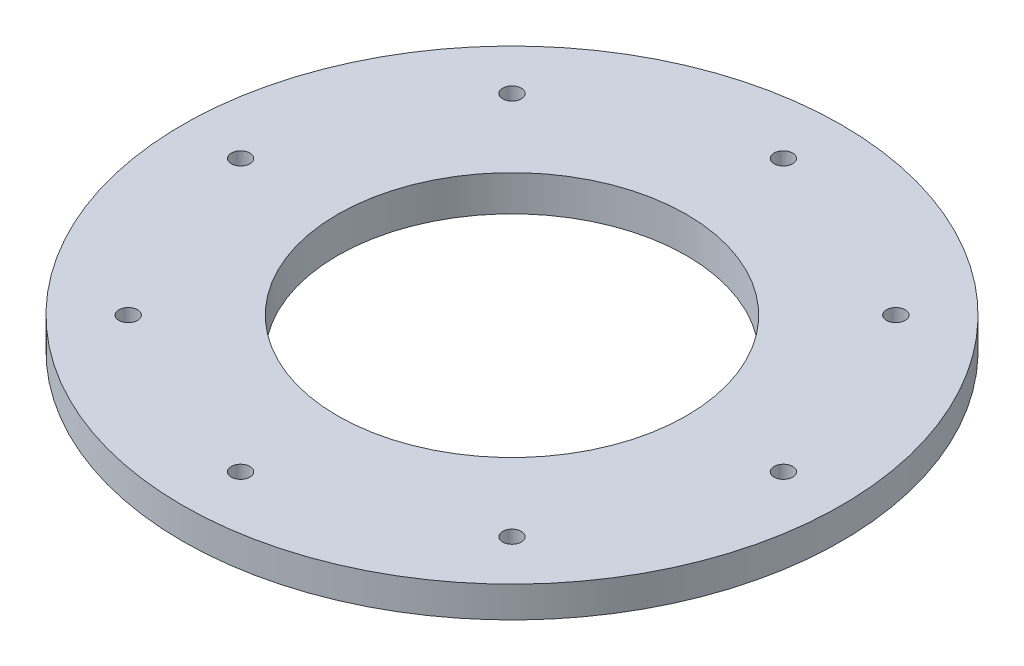
ISO-10303-21;
HEADER;
FILE_DESCRIPTION(('STEP AP214'),'2;1');
FILE_NAME('part.step','',(''),(''),'','','');
FILE_SCHEMA(('AUTOMOTIVE_DESIGN { 1 0 10303 214 1 1 1 1 }'));
ENDSEC;
DATA;
#1=APPLICATION_CONTEXT('core data for automotive mechanical design processes');
#2=APPLICATION_PROTOCOL_DEFINITION('international standard','automotive_design',2000,#1);
#3=PRODUCT_CONTEXT('',#1,'mechanical');
#4=PRODUCT('Part','Part','',(#3));
#5=PRODUCT_RELATED_PRODUCT_CATEGORY('part','',(#4));
#6=PRODUCT_DEFINITION_FORMATION('','',#4);
#7=PRODUCT_DEFINITION_CONTEXT('part definition',#1,'design');
#8=PRODUCT_DEFINITION('design','',#6,#7);
#9=PRODUCT_DEFINITION_SHAPE('','',#8);
#10=(LENGTH_UNIT() NAMED_UNIT(*) SI_UNIT(.MILLI.,.METRE.));
#11=(NAMED_UNIT(*) PLANE_ANGLE_UNIT() SI_UNIT($,.RADIAN.));
#12=(NAMED_UNIT(*) SI_UNIT($,.STERADIAN.) SOLID_ANGLE_UNIT());
#13=UNCERTAINTY_MEASURE_WITH_UNIT(LENGTH_MEASURE(1.E-05),#10,'distance_accuracy_value','');
#14=(GEOMETRIC_REPRESENTATION_CONTEXT(3) GLOBAL_UNCERTAINTY_ASSIGNED_CONTEXT((#13)) GLOBAL_UNIT_ASSIGNED_CONTEXT((#10,
#11,#12)) REPRESENTATION_CONTEXT('',''));
#15=CARTESIAN_POINT('',(0.,0.,0.));
#16=DIRECTION('',(0.,0.,1.));
#17=DIRECTION('',(1.,0.,0.));
#18=AXIS2_PLACEMENT_3D('',#15,#16,#17);
#19=CARTESIAN_POINT('',(0.,0.6,0.));
#20=DIRECTION('',(0.,-1.,0.));
#21=DIRECTION('',(0.,0.,-1.));
#22=AXIS2_PLACEMENT_3D('',#19,#20,#21);
#23=CYLINDRICAL_SURFACE('',#22,40.);
#24=CARTESIAN_POINT('',(0.,0.6,0.));
#25=DIRECTION('',(0.,1.,0.));
#26=DIRECTION('',(0.,0.,1.));
#27=AXIS2_PLACEMENT_3D('',#24,#25,#26);
#28=CIRCLE('',#27,40.);
#29=CARTESIAN_POINT('',(0.,0.6,40.));
#30=VERTEX_POINT('',#29);
#31=EDGE_CURVE('E10',#30,#30,#28,.T.);
#32=ORIENTED_EDGE('',*,*,#31,.F.);
#33=EDGE_LOOP('',(#32));
#34=FACE_BOUND('',#33,.T.);
#35=CARTESIAN_POINT('',(0.,0.,0.));
#36=DIRECTION('',(0.,1.,0.));
#37=DIRECTION('',(0.,0.,1.));
#38=AXIS2_PLACEMENT_3D('',#35,#36,#37);
#39=CIRCLE('',#38,40.);
#40=CARTESIAN_POINT('',(0.,0.,40.));
#41=VERTEX_POINT('',#40);
#42=EDGE_CURVE('E44',#41,#41,#39,.T.);
#43=ORIENTED_EDGE('',*,*,#42,.T.);
#44=EDGE_LOOP('',(#43));
#45=FACE_BOUND('',#44,.T.);
#46=ADVANCED_FACE('F41',(#34,#45),#23,.T.);
#47=CARTESIAN_POINT('',(0.,0.,0.));
#48=DIRECTION('',(0.,1.,0.));
#49=DIRECTION('',(0.,0.,1.));
#50=AXIS2_PLACEMENT_3D('',#47,#48,#49);
#51=PLANE('',#50);
#52=CARTESIAN_POINT('',(0.,0.,35.));
#53=DIRECTION('',(0.,-1.,0.));
#54=DIRECTION('',(0.,0.,-1.));
#55=AXIS2_PLACEMENT_3D('',#52,#53,#54);
#56=CIRCLE('',#55,1.2);
#57=CARTESIAN_POINT('',(0.,0.,33.8));
#58=VERTEX_POINT('',#57);
#59=EDGE_CURVE('E127',#58,#58,#56,.T.);
#60=ORIENTED_EDGE('',*,*,#59,.F.);
#61=EDGE_LOOP('',(#60));
#62=FACE_BOUND('',#61,.T.);
#63=CARTESIAN_POINT('',(24.7487373415296,0.,24.7487373415287));
#64=DIRECTION('',(0.,-1.,0.));
#65=DIRECTION('',(0.,0.,-1.));
#66=AXIS2_PLACEMENT_3D('',#63,#64,#65);
#67=CIRCLE('',#66,1.2);
#68=CARTESIAN_POINT('',(24.7487373415296,0.,23.5487373415287));
#69=VERTEX_POINT('',#68);
#70=EDGE_CURVE('E123',#69,#69,#67,.T.);
#71=ORIENTED_EDGE('',*,*,#70,.F.);
#72=EDGE_LOOP('',(#71));
#73=FACE_BOUND('',#72,.T.);
#74=CARTESIAN_POINT('',(35.0000000000005,0.,-1.1408314719531E-12));
#75=DIRECTION('',(0.,-1.,0.));
#76=DIRECTION('',(0.,0.,-1.));
#77=AXIS2_PLACEMENT_3D('',#74,#75,#76);
#78=CIRCLE('',#77,1.2);
#79=CARTESIAN_POINT('',(35.0000000000005,0.,-1.20000000000114));
#80=VERTEX_POINT('',#79);
#81=EDGE_CURVE('E115',#80,#80,#78,.T.);
#82=ORIENTED_EDGE('',*,*,#81,.F.);
#83=EDGE_LOOP('',(#82));
#84=FACE_BOUND('',#83,.T.);
#85=CARTESIAN_POINT('',(24.7487373415292,0.,-24.7487373415308));
#86=DIRECTION('',(0.,-1.,0.));
#87=DIRECTION('',(0.,0.,-1.));
#88=AXIS2_PLACEMENT_3D('',#85,#86,#87);
#89=CIRCLE('',#88,1.2);
#90=CARTESIAN_POINT('',(24.7487373415292,0.,-25.9487373415308));
#91=VERTEX_POINT('',#90);
#92=EDGE_CURVE('E107',#91,#91,#89,.T.);
#93=ORIENTED_EDGE('',*,*,#92,.F.);
#94=EDGE_LOOP('',(#93));
#95=FACE_BOUND('',#94,.T.);
#96=CARTESIAN_POINT('',(-6.7183955819972E-13,0.,-35.0000000000016));
#97=DIRECTION('',(0.,-1.,0.));
#98=DIRECTION('',(0.,0.,-1.));
#99=AXIS2_PLACEMENT_3D('',#96,#97,#98);
#100=CIRCLE('',#99,1.2);
#101=CARTESIAN_POINT('',(-6.7183955819972E-13,0.,-36.2000000000016));
#102=VERTEX_POINT('',#101);
#103=EDGE_CURVE('E99',#102,#102,#100,.T.);
#104=ORIENTED_EDGE('',*,*,#103,.F.);
#105=EDGE_LOOP('',(#104));
#106=FACE_BOUND('',#105,.T.);
#107=CARTESIAN_POINT('',(-24.7487373415303,0.,-24.7487373415303));
#108=DIRECTION('',(0.,-1.,0.));
#109=DIRECTION('',(0.,0.,-1.));
#110=AXIS2_PLACEMENT_3D('',#107,#108,#109);
#111=CIRCLE('',#110,1.2);
#112=CARTESIAN_POINT('',(-24.7487373415303,0.,-25.9487373415303));
#113=VERTEX_POINT('',#112);
#114=EDGE_CURVE('E92',#113,#113,#111,.T.);
#115=ORIENTED_EDGE('',*,*,#114,.F.);
#116=EDGE_LOOP('',(#115));
#117=FACE_BOUND('',#116,.T.);
#118=CARTESIAN_POINT('',(-35.0000000000012,0.,-4.73278177550394E-13));
#119=DIRECTION('',(0.,-1.,0.));
#120=DIRECTION('',(0.,0.,-1.));
#121=AXIS2_PLACEMENT_3D('',#118,#119,#120);
#122=CIRCLE('',#121,1.2);
#123=CARTESIAN_POINT('',(-35.0000000000012,0.,-1.20000000000047));
#124=VERTEX_POINT('',#123);
#125=EDGE_CURVE('E84',#124,#124,#122,.T.);
#126=ORIENTED_EDGE('',*,*,#125,.F.);
#127=EDGE_LOOP('',(#126));
#128=FACE_BOUND('',#127,.T.);
#129=CARTESIAN_POINT('',(-24.7487373415298,0.,24.7487373415292));
#130=DIRECTION('',(0.,-1.,0.));
#131=DIRECTION('',(0.,0.,-1.));
#132=AXIS2_PLACEMENT_3D('',#129,#130,#131);
#133=CIRCLE('',#132,1.2);
#134=CARTESIAN_POINT('',(-24.7487373415298,0.,23.5487373415292));
#135=VERTEX_POINT('',#134);
#136=EDGE_CURVE('E76',#135,#135,#133,.T.);
#137=ORIENTED_EDGE('',*,*,#136,.F.);
#138=EDGE_LOOP('',(#137));
#139=FACE_BOUND('',#138,.T.);
#140=CARTESIAN_POINT('',(0.,0.,0.));
#141=DIRECTION('',(0.,-1.,0.));
#142=DIRECTION('',(0.,0.,-1.));
#143=AXIS2_PLACEMENT_3D('',#140,#141,#142);
#144=CIRCLE('',#143,22.5);
#145=CARTESIAN_POINT('',(0.,0.,-22.5));
#146=VERTEX_POINT('',#145);
#147=EDGE_CURVE('E64',#146,#146,#144,.T.);
#148=ORIENTED_EDGE('',*,*,#147,.F.);
#149=EDGE_LOOP('',(#148));
#150=FACE_BOUND('',#149,.T.);
#151=ORIENTED_EDGE('',*,*,#42,.F.);
#152=EDGE_LOOP('',(#151));
#153=FACE_BOUND('',#152,.T.);
#154=ADVANCED_FACE('F145',(#62,#73,#84,#95,#106,#117,#128,#139,#150,#153),#51,.F.);
#155=CARTESIAN_POINT('',(0.,4.6,0.));
#156=DIRECTION('',(0.,-1.,0.));
#157=DIRECTION('',(0.,0.,-1.));
#158=AXIS2_PLACEMENT_3D('',#155,#156,#157);
#159=CYLINDRICAL_SURFACE('',#158,42.5);
#160=CARTESIAN_POINT('',(0.,4.6,0.));
#161=DIRECTION('',(0.,1.,0.));
#162=DIRECTION('',(0.,0.,1.));
#163=AXIS2_PLACEMENT_3D('',#160,#161,#162);
#164=CIRCLE('',#163,42.5);
#165=CARTESIAN_POINT('',(0.,4.6,42.5));
#166=VERTEX_POINT('',#165);
#167=EDGE_CURVE('E54',#166,#166,#164,.T.);
#168=ORIENTED_EDGE('',*,*,#167,.F.);
#169=EDGE_LOOP('',(#168));
#170=FACE_BOUND('',#169,.T.);
#171=CARTESIAN_POINT('',(0.,0.6,0.));
#172=DIRECTION('',(0.,1.,0.));
#173=DIRECTION('',(0.,0.,1.));
#174=AXIS2_PLACEMENT_3D('',#171,#172,#173);
#175=CIRCLE('',#174,42.5);
#176=CARTESIAN_POINT('',(0.,0.6,42.5));
#177=VERTEX_POINT('',#176);
#178=EDGE_CURVE('E56',#177,#177,#175,.T.);
#179=ORIENTED_EDGE('',*,*,#178,.T.);
#180=EDGE_LOOP('',(#179));
#181=FACE_BOUND('',#180,.T.);
#182=ADVANCED_FACE('F148',(#170,#181),#159,.T.);
#183=CARTESIAN_POINT('',(0.,4.6,0.));
#184=DIRECTION('',(0.,1.,0.));
#185=DIRECTION('',(0.,0.,1.));
#186=AXIS2_PLACEMENT_3D('',#183,#184,#185);
#187=PLANE('',#186);
#188=CARTESIAN_POINT('',(0.,4.6,35.));
#189=DIRECTION('',(0.,-1.,0.));
#190=DIRECTION('',(0.,0.,-1.));
#191=AXIS2_PLACEMENT_3D('',#188,#189,#190);
#192=CIRCLE('',#191,1.2);
#193=CARTESIAN_POINT('',(0.,4.6,33.8));
#194=VERTEX_POINT('',#193);
#195=EDGE_CURVE('E68',#194,#194,#192,.T.);
#196=ORIENTED_EDGE('',*,*,#195,.T.);
#197=EDGE_LOOP('',(#196));
#198=FACE_BOUND('',#197,.T.);
#199=CARTESIAN_POINT('',(24.7487373415296,4.6,24.7487373415287));
#200=DIRECTION('',(0.,-1.,0.));
#201=DIRECTION('',(0.,0.,-1.));
#202=AXIS2_PLACEMENT_3D('',#199,#200,#201);
#203=CIRCLE('',#202,1.2);
#204=CARTESIAN_POINT('',(24.7487373415296,4.6,23.5487373415287));
#205=VERTEX_POINT('',#204);
#206=EDGE_CURVE('E119',#205,#205,#203,.T.);
#207=ORIENTED_EDGE('',*,*,#206,.T.);
#208=EDGE_LOOP('',(#207));
#209=FACE_BOUND('',#208,.T.);
#210=CARTESIAN_POINT('',(35.0000000000005,4.6,-1.1408314719531E-12));
#211=DIRECTION('',(0.,-1.,0.));
#212=DIRECTION('',(0.,0.,-1.));
#213=AXIS2_PLACEMENT_3D('',#210,#211,#212);
#214=CIRCLE('',#213,1.2);
#215=CARTESIAN_POINT('',(35.0000000000005,4.6,-1.20000000000114));
#216=VERTEX_POINT('',#215);
#217=EDGE_CURVE('E111',#216,#216,#214,.T.);
#218=ORIENTED_EDGE('',*,*,#217,.T.);
#219=EDGE_LOOP('',(#218));
#220=FACE_BOUND('',#219,.T.);
#221=CARTESIAN_POINT('',(24.7487373415292,4.6,-24.7487373415308));
#222=DIRECTION('',(0.,-1.,0.));
#223=DIRECTION('',(0.,0.,-1.));
#224=AXIS2_PLACEMENT_3D('',#221,#222,#223);
#225=CIRCLE('',#224,1.2);
#226=CARTESIAN_POINT('',(24.7487373415292,4.6,-25.9487373415308));
#227=VERTEX_POINT('',#226);
#228=EDGE_CURVE('E103',#227,#227,#225,.T.);
#229=ORIENTED_EDGE('',*,*,#228,.T.);
#230=EDGE_LOOP('',(#229));
#231=FACE_BOUND('',#230,.T.);
#232=CARTESIAN_POINT('',(-6.7183955819972E-13,4.6,-35.0000000000016));
#233=DIRECTION('',(0.,-1.,0.));
#234=DIRECTION('',(0.,0.,-1.));
#235=AXIS2_PLACEMENT_3D('',#232,#233,#234);
#236=CIRCLE('',#235,1.2);
#237=CARTESIAN_POINT('',(-6.7183955819972E-13,4.6,-36.2000000000016));
#238=VERTEX_POINT('',#237);
#239=EDGE_CURVE('E95',#238,#238,#236,.T.);
#240=ORIENTED_EDGE('',*,*,#239,.T.);
#241=EDGE_LOOP('',(#240));
#242=FACE_BOUND('',#241,.T.);
#243=CARTESIAN_POINT('',(-24.7487373415303,4.6,-24.7487373415303));
#244=DIRECTION('',(0.,-1.,0.));
#245=DIRECTION('',(0.,0.,-1.));
#246=AXIS2_PLACEMENT_3D('',#243,#244,#245);
#247=CIRCLE('',#246,1.2);
#248=CARTESIAN_POINT('',(-24.7487373415303,4.6,-25.9487373415303));
#249=VERTEX_POINT('',#248);
#250=EDGE_CURVE('E88',#249,#249,#247,.T.);
#251=ORIENTED_EDGE('',*,*,#250,.T.);
#252=EDGE_LOOP('',(#251));
#253=FACE_BOUND('',#252,.T.);
#254=CARTESIAN_POINT('',(-35.0000000000012,4.6,-4.73278177550394E-13));
#255=DIRECTION('',(0.,-1.,0.));
#256=DIRECTION('',(0.,0.,-1.));
#257=AXIS2_PLACEMENT_3D('',#254,#255,#256);
#258=CIRCLE('',#257,1.2);
#259=CARTESIAN_POINT('',(-35.0000000000012,4.6,-1.20000000000047));
#260=VERTEX_POINT('',#259);
#261=EDGE_CURVE('E80',#260,#260,#258,.T.);
#262=ORIENTED_EDGE('',*,*,#261,.T.);
#263=EDGE_LOOP('',(#262));
#264=FACE_BOUND('',#263,.T.);
#265=CARTESIAN_POINT('',(-24.7487373415298,4.6,24.7487373415292));
#266=DIRECTION('',(0.,-1.,0.));
#267=DIRECTION('',(0.,0.,-1.));
#268=AXIS2_PLACEMENT_3D('',#265,#266,#267);
#269=CIRCLE('',#268,1.2);
#270=CARTESIAN_POINT('',(-24.7487373415298,4.6,23.5487373415292));
#271=VERTEX_POINT('',#270);
#272=EDGE_CURVE('E72',#271,#271,#269,.T.);
#273=ORIENTED_EDGE('',*,*,#272,.T.);
#274=EDGE_LOOP('',(#273));
#275=FACE_BOUND('',#274,.T.);
#276=CARTESIAN_POINT('',(0.,4.6,0.));
#277=DIRECTION('',(0.,-1.,0.));
#278=DIRECTION('',(0.,0.,-1.));
#279=AXIS2_PLACEMENT_3D('',#276,#277,#278);
#280=CIRCLE('',#279,22.5);
#281=CARTESIAN_POINT('',(0.,4.6,-22.5));
#282=VERTEX_POINT('',#281);
#283=EDGE_CURVE('E60',#282,#282,#280,.T.);
#284=ORIENTED_EDGE('',*,*,#283,.T.);
#285=EDGE_LOOP('',(#284));
#286=FACE_BOUND('',#285,.T.);
#287=ORIENTED_EDGE('',*,*,#167,.T.);
#288=EDGE_LOOP('',(#287));
#289=FACE_BOUND('',#288,.T.);
#290=ADVANCED_FACE('F135',(#198,#209,#220,#231,#242,#253,#264,#275,#286,#289),#187,.T.);
#291=CARTESIAN_POINT('',(0.,0.6,0.));
#292=DIRECTION('',(0.,1.,0.));
#293=DIRECTION('',(0.,0.,1.));
#294=AXIS2_PLACEMENT_3D('',#291,#292,#293);
#295=PLANE('',#294);
#296=ORIENTED_EDGE('',*,*,#31,.T.);
#297=EDGE_LOOP('',(#296));
#298=FACE_BOUND('',#297,.T.);
#299=ORIENTED_EDGE('',*,*,#178,.F.);
#300=EDGE_LOOP('',(#299));
#301=FACE_BOUND('',#300,.T.);
#302=ADVANCED_FACE('F186',(#298,#301),#295,.F.);
#303=CARTESIAN_POINT('',(0.,4.6,0.));
#304=DIRECTION('',(0.,-1.,0.));
#305=DIRECTION('',(0.,0.,-1.));
#306=AXIS2_PLACEMENT_3D('',#303,#304,#305);
#307=CYLINDRICAL_SURFACE('',#306,22.5);
#308=ORIENTED_EDGE('',*,*,#283,.F.);
#309=EDGE_LOOP('',(#308));
#310=FACE_BOUND('',#309,.T.);
#311=ORIENTED_EDGE('',*,*,#147,.T.);
#312=EDGE_LOOP('',(#311));
#313=FACE_BOUND('',#312,.T.);
#314=ADVANCED_FACE('F192',(#310,#313),#307,.F.);
#315=CARTESIAN_POINT('',(-24.7487373415298,4.6,24.7487373415292));
#316=DIRECTION('',(0.,-1.,0.));
#317=DIRECTION('',(0.,0.,-1.));
#318=AXIS2_PLACEMENT_3D('',#315,#316,#317);
#319=CYLINDRICAL_SURFACE('',#318,1.2);
#320=ORIENTED_EDGE('',*,*,#272,.F.);
#321=EDGE_LOOP('',(#320));
#322=FACE_BOUND('',#321,.T.);
#323=ORIENTED_EDGE('',*,*,#136,.T.);
#324=EDGE_LOOP('',(#323));
#325=FACE_BOUND('',#324,.T.);
#326=ADVANCED_FACE('F197',(#322,#325),#319,.F.);
#327=CARTESIAN_POINT('',(-35.0000000000012,4.6,-4.73278177550394E-13));
#328=DIRECTION('',(0.,-1.,0.));
#329=DIRECTION('',(0.,0.,-1.));
#330=AXIS2_PLACEMENT_3D('',#327,#328,#329);
#331=CYLINDRICAL_SURFACE('',#330,1.2);
#332=ORIENTED_EDGE('',*,*,#261,.F.);
#333=EDGE_LOOP('',(#332));
#334=FACE_BOUND('',#333,.T.);
#335=ORIENTED_EDGE('',*,*,#125,.T.);
#336=EDGE_LOOP('',(#335));
#337=FACE_BOUND('',#336,.T.);
#338=ADVANCED_FACE('F203',(#334,#337),#331,.F.);
#339=CARTESIAN_POINT('',(-24.7487373415303,4.6,-24.7487373415303));
#340=DIRECTION('',(0.,-1.,0.));
#341=DIRECTION('',(0.,0.,-1.));
#342=AXIS2_PLACEMENT_3D('',#339,#340,#341);
#343=CYLINDRICAL_SURFACE('',#342,1.2);
#344=ORIENTED_EDGE('',*,*,#250,.F.);
#345=EDGE_LOOP('',(#344));
#346=FACE_BOUND('',#345,.T.);
#347=ORIENTED_EDGE('',*,*,#114,.T.);
#348=EDGE_LOOP('',(#347));
#349=FACE_BOUND('',#348,.T.);
#350=ADVANCED_FACE('F210',(#346,#349),#343,.F.);
#351=CARTESIAN_POINT('',(-6.7183955819972E-13,4.6,-35.0000000000016));
#352=DIRECTION('',(0.,-1.,0.));
#353=DIRECTION('',(0.,0.,-1.));
#354=AXIS2_PLACEMENT_3D('',#351,#352,#353);
#355=CYLINDRICAL_SURFACE('',#354,1.2);
#356=ORIENTED_EDGE('',*,*,#239,.F.);
#357=EDGE_LOOP('',(#356));
#358=FACE_BOUND('',#357,.T.);
#359=ORIENTED_EDGE('',*,*,#103,.T.);
#360=EDGE_LOOP('',(#359));
#361=FACE_BOUND('',#360,.T.);
#362=ADVANCED_FACE('F217',(#358,#361),#355,.F.);
#363=CARTESIAN_POINT('',(24.7487373415292,4.6,-24.7487373415308));
#364=DIRECTION('',(0.,-1.,0.));
#365=DIRECTION('',(0.,0.,-1.));
#366=AXIS2_PLACEMENT_3D('',#363,#364,#365);
#367=CYLINDRICAL_SURFACE('',#366,1.2);
#368=ORIENTED_EDGE('',*,*,#228,.F.);
#369=EDGE_LOOP('',(#368));
#370=FACE_BOUND('',#369,.T.);
#371=ORIENTED_EDGE('',*,*,#92,.T.);
#372=EDGE_LOOP('',(#371));
#373=FACE_BOUND('',#372,.T.);
#374=ADVANCED_FACE('F224',(#370,#373),#367,.F.);
#375=CARTESIAN_POINT('',(35.0000000000005,4.6,-1.1408314719531E-12));
#376=DIRECTION('',(0.,-1.,0.));
#377=DIRECTION('',(0.,0.,-1.));
#378=AXIS2_PLACEMENT_3D('',#375,#376,#377);
#379=CYLINDRICAL_SURFACE('',#378,1.2);
#380=ORIENTED_EDGE('',*,*,#217,.F.);
#381=EDGE_LOOP('',(#380));
#382=FACE_BOUND('',#381,.T.);
#383=ORIENTED_EDGE('',*,*,#81,.T.);
#384=EDGE_LOOP('',(#383));
#385=FACE_BOUND('',#384,.T.);
#386=ADVANCED_FACE('F231',(#382,#385),#379,.F.);
#387=CARTESIAN_POINT('',(24.7487373415296,4.6,24.7487373415287));
#388=DIRECTION('',(0.,-1.,0.));
#389=DIRECTION('',(0.,0.,-1.));
#390=AXIS2_PLACEMENT_3D('',#387,#388,#389);
#391=CYLINDRICAL_SURFACE('',#390,1.2);
#392=ORIENTED_EDGE('',*,*,#206,.F.);
#393=EDGE_LOOP('',(#392));
#394=FACE_BOUND('',#393,.T.);
#395=ORIENTED_EDGE('',*,*,#70,.T.);
#396=EDGE_LOOP('',(#395));
#397=FACE_BOUND('',#396,.T.);
#398=ADVANCED_FACE('F141',(#394,#397),#391,.F.);
#399=CARTESIAN_POINT('',(0.,4.6,35.));
#400=DIRECTION('',(0.,-1.,0.));
#401=DIRECTION('',(0.,0.,-1.));
#402=AXIS2_PLACEMENT_3D('',#399,#400,#401);
#403=CYLINDRICAL_SURFACE('',#402,1.2);
#404=ORIENTED_EDGE('',*,*,#195,.F.);
#405=EDGE_LOOP('',(#404));
#406=FACE_BOUND('',#405,.T.);
#407=ORIENTED_EDGE('',*,*,#59,.T.);
#408=EDGE_LOOP('',(#407));
#409=FACE_BOUND('',#408,.T.);
#410=ADVANCED_FACE('F138',(#406,#409),#403,.F.);
#411=CLOSED_SHELL('',(#46,#154,#182,#290,#302,#314,#326,#338,#350,#362,#374,#386,#398,#410));
#412=MANIFOLD_SOLID_BREP('B2',#411);
#413=ADVANCED_BREP_SHAPE_REPRESENTATION('',(#18,#412),#14);
#414=SHAPE_DEFINITION_REPRESENTATION(#9,#413);
ENDSEC;
END-ISO-10303-21;
